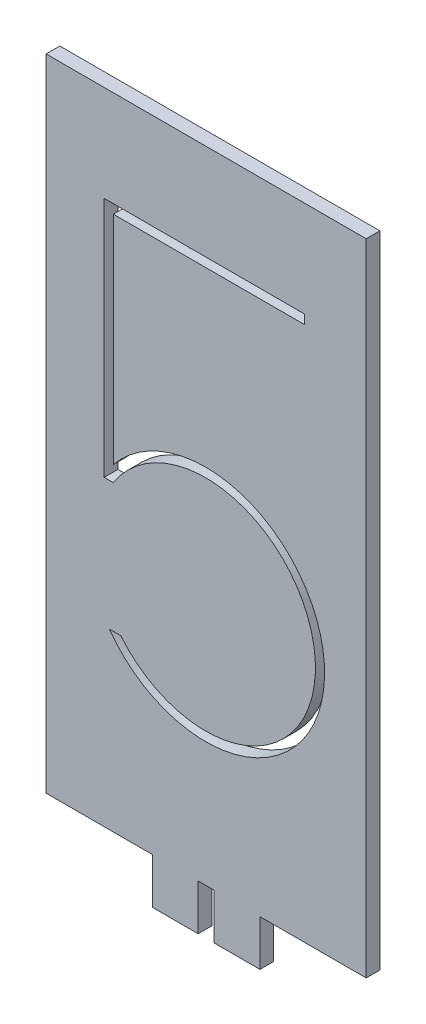
ISO-10303-21;
HEADER;
FILE_DESCRIPTION(('STEP AP214'),'2;1');
FILE_NAME('part.step','',(''),(''),'','','');
FILE_SCHEMA(('AUTOMOTIVE_DESIGN { 1 0 10303 214 1 1 1 1 }'));
ENDSEC;
DATA;
#1=APPLICATION_CONTEXT('core data for automotive mechanical design processes');
#2=APPLICATION_PROTOCOL_DEFINITION('international standard','automotive_design',2000,#1);
#3=PRODUCT_CONTEXT('',#1,'mechanical');
#4=PRODUCT('Part','Part','',(#3));
#5=PRODUCT_RELATED_PRODUCT_CATEGORY('part','',(#4));
#6=PRODUCT_DEFINITION_FORMATION('','',#4);
#7=PRODUCT_DEFINITION_CONTEXT('part definition',#1,'design');
#8=PRODUCT_DEFINITION('design','',#6,#7);
#9=PRODUCT_DEFINITION_SHAPE('','',#8);
#10=(LENGTH_UNIT() NAMED_UNIT(*) SI_UNIT(.MILLI.,.METRE.));
#11=(NAMED_UNIT(*) PLANE_ANGLE_UNIT() SI_UNIT($,.RADIAN.));
#12=(NAMED_UNIT(*) SI_UNIT($,.STERADIAN.) SOLID_ANGLE_UNIT());
#13=UNCERTAINTY_MEASURE_WITH_UNIT(LENGTH_MEASURE(1.E-05),#10,'distance_accuracy_value','');
#14=(GEOMETRIC_REPRESENTATION_CONTEXT(3) GLOBAL_UNCERTAINTY_ASSIGNED_CONTEXT((#13)) GLOBAL_UNIT_ASSIGNED_CONTEXT((#10,
#11,#12)) REPRESENTATION_CONTEXT('',''));
#15=CARTESIAN_POINT('',(0.,0.,0.));
#16=DIRECTION('',(0.,0.,1.));
#17=DIRECTION('',(1.,0.,0.));
#18=AXIS2_PLACEMENT_3D('',#15,#16,#17);
#19=CARTESIAN_POINT('',(0.,0.,1.5));
#20=DIRECTION('',(0.,1.,0.));
#21=DIRECTION('',(0.,0.,1.));
#22=AXIS2_PLACEMENT_3D('',#19,#20,#21);
#23=PLANE('',#22);
#24=DIRECTION('',(1.,0.,0.));
#25=VECTOR('',#24,1.);
#26=CARTESIAN_POINT('',(0.,0.,1.5));
#27=LINE('',#26,#25);
#28=CARTESIAN_POINT('',(11.63,0.,1.5));
#29=VERTEX_POINT('',#28);
#30=CARTESIAN_POINT('',(16.63,0.,1.5));
#31=VERTEX_POINT('',#30);
#32=EDGE_CURVE('E362',#29,#31,#27,.T.);
#33=ORIENTED_EDGE('',*,*,#32,.F.);
#34=DIRECTION('',(0.,0.,1.));
#35=VECTOR('',#34,1.);
#36=CARTESIAN_POINT('',(11.63,0.,0.));
#37=LINE('',#36,#35);
#38=CARTESIAN_POINT('',(11.63,0.,0.));
#39=VERTEX_POINT('',#38);
#40=EDGE_CURVE('E278',#39,#29,#37,.T.);
#41=ORIENTED_EDGE('',*,*,#40,.F.);
#42=DIRECTION('',(1.,0.,0.));
#43=VECTOR('',#42,1.);
#44=CARTESIAN_POINT('',(0.,0.,0.));
#45=LINE('',#44,#43);
#46=CARTESIAN_POINT('',(16.63,0.,0.));
#47=VERTEX_POINT('',#46);
#48=EDGE_CURVE('E377',#39,#47,#45,.T.);
#49=ORIENTED_EDGE('',*,*,#48,.T.);
#50=DIRECTION('',(0.,0.,1.));
#51=VECTOR('',#50,1.);
#52=CARTESIAN_POINT('',(16.63,0.,0.));
#53=LINE('',#52,#51);
#54=EDGE_CURVE('E332',#47,#31,#53,.T.);
#55=ORIENTED_EDGE('',*,*,#54,.T.);
#56=EDGE_LOOP('',(#33,#41,#49,#55));
#57=FACE_BOUND('',#56,.T.);
#58=ADVANCED_FACE('F39',(#57),#23,.F.);
#59=CARTESIAN_POINT('',(0.,0.,1.5));
#60=DIRECTION('',(1.,0.,0.));
#61=DIRECTION('',(0.,1.,0.));
#62=AXIS2_PLACEMENT_3D('',#59,#60,#61);
#63=PLANE('',#62);
#64=DIRECTION('',(0.,-1.,0.));
#65=VECTOR('',#64,1.);
#66=CARTESIAN_POINT('',(0.,0.,0.));
#67=LINE('',#66,#65);
#68=CARTESIAN_POINT('',(0.,75.,0.));
#69=VERTEX_POINT('',#68);
#70=CARTESIAN_POINT('',(0.,5.,0.));
#71=VERTEX_POINT('',#70);
#72=EDGE_CURVE('E290',#69,#71,#67,.T.);
#73=ORIENTED_EDGE('',*,*,#72,.T.);
#74=DIRECTION('',(0.,0.,1.));
#75=VECTOR('',#74,1.);
#76=CARTESIAN_POINT('',(0.,5.,0.));
#77=LINE('',#76,#75);
#78=CARTESIAN_POINT('',(0.,5.,1.5));
#79=VERTEX_POINT('',#78);
#80=EDGE_CURVE('E286',#71,#79,#77,.T.);
#81=ORIENTED_EDGE('',*,*,#80,.T.);
#82=DIRECTION('',(0.,-1.,0.));
#83=VECTOR('',#82,1.);
#84=CARTESIAN_POINT('',(0.,0.,1.5));
#85=LINE('',#84,#83);
#86=CARTESIAN_POINT('',(0.,75.,1.5));
#87=VERTEX_POINT('',#86);
#88=EDGE_CURVE('E353',#87,#79,#85,.T.);
#89=ORIENTED_EDGE('',*,*,#88,.F.);
#90=DIRECTION('',(0.,0.,-1.));
#91=VECTOR('',#90,1.);
#92=CARTESIAN_POINT('',(0.,75.,1.5));
#93=LINE('',#92,#91);
#94=EDGE_CURVE('E369',#87,#69,#93,.T.);
#95=ORIENTED_EDGE('',*,*,#94,.T.);
#96=EDGE_LOOP('',(#73,#81,#89,#95));
#97=FACE_BOUND('',#96,.T.);
#98=ADVANCED_FACE('F41',(#97),#63,.F.);
#99=CARTESIAN_POINT('',(18.38,0.,0.));
#100=VERTEX_POINT('',#99);
#101=CARTESIAN_POINT('',(23.38,0.,0.));
#102=VERTEX_POINT('',#101);
#103=EDGE_CURVE('E373',#100,#102,#45,.T.);
#104=ORIENTED_EDGE('',*,*,#103,.T.);
#105=DIRECTION('',(0.,0.,1.));
#106=VECTOR('',#105,1.);
#107=CARTESIAN_POINT('',(23.38,0.,0.));
#108=LINE('',#107,#106);
#109=CARTESIAN_POINT('',(23.38,0.,1.5));
#110=VERTEX_POINT('',#109);
#111=EDGE_CURVE('E303',#102,#110,#108,.T.);
#112=ORIENTED_EDGE('',*,*,#111,.T.);
#113=CARTESIAN_POINT('',(18.38,0.,1.5));
#114=VERTEX_POINT('',#113);
#115=EDGE_CURVE('E357',#114,#110,#27,.T.);
#116=ORIENTED_EDGE('',*,*,#115,.F.);
#117=DIRECTION('',(0.,0.,1.));
#118=VECTOR('',#117,1.);
#119=CARTESIAN_POINT('',(18.38,0.,0.));
#120=LINE('',#119,#118);
#121=EDGE_CURVE('E347',#100,#114,#120,.T.);
#122=ORIENTED_EDGE('',*,*,#121,.F.);
#123=EDGE_LOOP('',(#104,#112,#116,#122));
#124=FACE_BOUND('',#123,.T.);
#125=ADVANCED_FACE('F446',(#124),#23,.F.);
#126=CARTESIAN_POINT('',(35.,0.,1.5));
#127=DIRECTION('',(-1.,0.,0.));
#128=DIRECTION('',(0.,-1.,0.));
#129=AXIS2_PLACEMENT_3D('',#126,#127,#128);
#130=PLANE('',#129);
#131=DIRECTION('',(0.,1.,0.));
#132=VECTOR('',#131,1.);
#133=CARTESIAN_POINT('',(35.,0.,1.5));
#134=LINE('',#133,#132);
#135=CARTESIAN_POINT('',(35.,5.,1.5));
#136=VERTEX_POINT('',#135);
#137=CARTESIAN_POINT('',(35.,75.,1.5));
#138=VERTEX_POINT('',#137);
#139=EDGE_CURVE('E363',#136,#138,#134,.T.);
#140=ORIENTED_EDGE('',*,*,#139,.F.);
#141=DIRECTION('',(0.,0.,1.));
#142=VECTOR('',#141,1.);
#143=CARTESIAN_POINT('',(35.,5.,0.));
#144=LINE('',#143,#142);
#145=CARTESIAN_POINT('',(35.,5.,0.));
#146=VERTEX_POINT('',#145);
#147=EDGE_CURVE('E313',#146,#136,#144,.T.);
#148=ORIENTED_EDGE('',*,*,#147,.F.);
#149=DIRECTION('',(0.,1.,0.));
#150=VECTOR('',#149,1.);
#151=CARTESIAN_POINT('',(35.,0.,0.));
#152=LINE('',#151,#150);
#153=CARTESIAN_POINT('',(35.,75.,0.));
#154=VERTEX_POINT('',#153);
#155=EDGE_CURVE('E378',#146,#154,#152,.T.);
#156=ORIENTED_EDGE('',*,*,#155,.T.);
#157=DIRECTION('',(0.,0.,-1.));
#158=VECTOR('',#157,1.);
#159=CARTESIAN_POINT('',(35.,75.,1.5));
#160=LINE('',#159,#158);
#161=EDGE_CURVE('E386',#138,#154,#160,.T.);
#162=ORIENTED_EDGE('',*,*,#161,.F.);
#163=EDGE_LOOP('',(#140,#148,#156,#162));
#164=FACE_BOUND('',#163,.T.);
#165=ADVANCED_FACE('F454',(#164),#130,.F.);
#166=CARTESIAN_POINT('',(0.,75.,1.5));
#167=DIRECTION('',(0.,-1.,0.));
#168=DIRECTION('',(0.,0.,-1.));
#169=AXIS2_PLACEMENT_3D('',#166,#167,#168);
#170=PLANE('',#169);
#171=DIRECTION('',(-1.,0.,0.));
#172=VECTOR('',#171,1.);
#173=CARTESIAN_POINT('',(0.,75.,0.));
#174=LINE('',#173,#172);
#175=EDGE_CURVE('E358',#154,#69,#174,.T.);
#176=ORIENTED_EDGE('',*,*,#175,.T.);
#177=ORIENTED_EDGE('',*,*,#94,.F.);
#178=DIRECTION('',(-1.,0.,0.));
#179=VECTOR('',#178,1.);
#180=CARTESIAN_POINT('',(0.,75.,1.5));
#181=LINE('',#180,#179);
#182=EDGE_CURVE('E366',#138,#87,#181,.T.);
#183=ORIENTED_EDGE('',*,*,#182,.F.);
#184=ORIENTED_EDGE('',*,*,#161,.T.);
#185=EDGE_LOOP('',(#176,#177,#183,#184));
#186=FACE_BOUND('',#185,.T.);
#187=ADVANCED_FACE('F459',(#186),#170,.F.);
#188=CARTESIAN_POINT('',(0.,0.,1.5));
#189=DIRECTION('',(0.,0.,-1.));
#190=DIRECTION('',(-1.,0.,0.));
#191=AXIS2_PLACEMENT_3D('',#188,#189,#190);
#192=PLANE('',#191);
#193=DIRECTION('',(1.,0.,0.));
#194=VECTOR('',#193,1.);
#195=CARTESIAN_POINT('',(7.35039959030423,63.5,1.5));
#196=LINE('',#195,#194);
#197=CARTESIAN_POINT('',(7.35039959030423,63.5,1.5));
#198=VERTEX_POINT('',#197);
#199=CARTESIAN_POINT('',(28.25,63.5,1.5));
#200=VERTEX_POINT('',#199);
#201=EDGE_CURVE('E187',#198,#200,#196,.T.);
#202=ORIENTED_EDGE('',*,*,#201,.F.);
#203=DIRECTION('',(0.,1.,0.));
#204=VECTOR('',#203,1.);
#205=CARTESIAN_POINT('',(7.35039959030423,38.0829980740736,1.5));
#206=LINE('',#205,#204);
#207=CARTESIAN_POINT('',(7.35039959030423,39.787205515762,1.5));
#208=VERTEX_POINT('',#207);
#209=EDGE_CURVE('E198',#208,#198,#206,.T.);
#210=ORIENTED_EDGE('',*,*,#209,.F.);
#211=CARTESIAN_POINT('',(17.4486572006261,31.6003139667322,1.5));
#212=DIRECTION('',(0.,0.,1.));
#213=DIRECTION('',(1.,0.,0.));
#214=AXIS2_PLACEMENT_3D('',#211,#212,#213);
#215=CIRCLE('',#214,13.);
#216=CARTESIAN_POINT('',(6.90262565731403,23.9989181286333,1.5));
#217=VERTEX_POINT('',#216);
#218=EDGE_CURVE('E249',#217,#208,#215,.T.);
#219=ORIENTED_EDGE('',*,*,#218,.F.);
#220=DIRECTION('',(-1.,0.,0.));
#221=VECTOR('',#220,1.);
#222=CARTESIAN_POINT('',(8.16325029987408,23.9989181286333,1.5));
#223=LINE('',#222,#221);
#224=CARTESIAN_POINT('',(8.16325029987408,23.9989181286333,1.5));
#225=VERTEX_POINT('',#224);
#226=EDGE_CURVE('E256',#225,#217,#223,.T.);
#227=ORIENTED_EDGE('',*,*,#226,.F.);
#228=CARTESIAN_POINT('',(17.4486572006261,31.6003139667322,1.5));
#229=DIRECTION('',(0.,0.,-1.));
#230=DIRECTION('',(1.,0.,0.));
#231=AXIS2_PLACEMENT_3D('',#228,#229,#230);
#232=CIRCLE('',#231,12.);
#233=CARTESIAN_POINT('',(7.35039959030423,38.0829980740736,1.5));
#234=VERTEX_POINT('',#233);
#235=EDGE_CURVE('E252',#234,#225,#232,.T.);
#236=ORIENTED_EDGE('',*,*,#235,.F.);
#237=DIRECTION('',(1.,0.,0.));
#238=VECTOR('',#237,1.);
#239=CARTESIAN_POINT('',(7.35039959030423,38.0829980740736,1.5));
#240=LINE('',#239,#238);
#241=CARTESIAN_POINT('',(6.35039959030423,38.0829980740736,1.5));
#242=VERTEX_POINT('',#241);
#243=EDGE_CURVE('E195',#242,#234,#240,.T.);
#244=ORIENTED_EDGE('',*,*,#243,.F.);
#245=DIRECTION('',(0.,-1.,0.));
#246=VECTOR('',#245,1.);
#247=CARTESIAN_POINT('',(6.35039959030423,38.0829980740736,1.5));
#248=LINE('',#247,#246);
#249=CARTESIAN_POINT('',(6.35039959030423,64.5,1.5));
#250=VERTEX_POINT('',#249);
#251=EDGE_CURVE('E221',#250,#242,#248,.T.);
#252=ORIENTED_EDGE('',*,*,#251,.F.);
#253=DIRECTION('',(-1.,0.,0.));
#254=VECTOR('',#253,1.);
#255=CARTESIAN_POINT('',(7.35039959030423,64.5,1.5));
#256=LINE('',#255,#254);
#257=CARTESIAN_POINT('',(28.25,64.5,1.5));
#258=VERTEX_POINT('',#257);
#259=EDGE_CURVE('E215',#258,#250,#256,.T.);
#260=ORIENTED_EDGE('',*,*,#259,.F.);
#261=DIRECTION('',(0.,1.,0.));
#262=VECTOR('',#261,1.);
#263=CARTESIAN_POINT('',(28.25,64.5,1.5));
#264=LINE('',#263,#262);
#265=EDGE_CURVE('E211',#200,#258,#264,.T.);
#266=ORIENTED_EDGE('',*,*,#265,.F.);
#267=EDGE_LOOP('',(#202,#210,#219,#227,#236,#244,#252,#260,#266));
#268=FACE_BOUND('',#267,.T.);
#269=ORIENTED_EDGE('',*,*,#88,.T.);
#270=DIRECTION('',(-1.,0.,0.));
#271=VECTOR('',#270,1.);
#272=CARTESIAN_POINT('',(0.,5.,1.5));
#273=LINE('',#272,#271);
#274=CARTESIAN_POINT('',(11.63,5.,1.5));
#275=VERTEX_POINT('',#274);
#276=EDGE_CURVE('E275',#275,#79,#273,.T.);
#277=ORIENTED_EDGE('',*,*,#276,.F.);
#278=DIRECTION('',(0.,1.,0.));
#279=VECTOR('',#278,1.);
#280=CARTESIAN_POINT('',(11.63,0.,1.5));
#281=LINE('',#280,#279);
#282=EDGE_CURVE('E279',#29,#275,#281,.T.);
#283=ORIENTED_EDGE('',*,*,#282,.F.);
#284=ORIENTED_EDGE('',*,*,#32,.T.);
#285=DIRECTION('',(0.,-1.,0.));
#286=VECTOR('',#285,1.);
#287=CARTESIAN_POINT('',(16.63,0.,1.5));
#288=LINE('',#287,#286);
#289=CARTESIAN_POINT('',(16.63,5.,1.5));
#290=VERTEX_POINT('',#289);
#291=EDGE_CURVE('E264',#290,#31,#288,.T.);
#292=ORIENTED_EDGE('',*,*,#291,.F.);
#293=DIRECTION('',(-1.,0.,0.));
#294=VECTOR('',#293,1.);
#295=CARTESIAN_POINT('',(16.63,5.,1.5));
#296=LINE('',#295,#294);
#297=CARTESIAN_POINT('',(18.38,5.,1.5));
#298=VERTEX_POINT('',#297);
#299=EDGE_CURVE('E324',#298,#290,#296,.T.);
#300=ORIENTED_EDGE('',*,*,#299,.F.);
#301=DIRECTION('',(0.,1.,0.));
#302=VECTOR('',#301,1.);
#303=CARTESIAN_POINT('',(18.38,0.,1.5));
#304=LINE('',#303,#302);
#305=EDGE_CURVE('E335',#114,#298,#304,.T.);
#306=ORIENTED_EDGE('',*,*,#305,.F.);
#307=ORIENTED_EDGE('',*,*,#115,.T.);
#308=DIRECTION('',(0.,-1.,0.));
#309=VECTOR('',#308,1.);
#310=CARTESIAN_POINT('',(23.38,5.,1.5));
#311=LINE('',#310,#309);
#312=CARTESIAN_POINT('',(23.38,5.,1.5));
#313=VERTEX_POINT('',#312);
#314=EDGE_CURVE('E304',#313,#110,#311,.T.);
#315=ORIENTED_EDGE('',*,*,#314,.F.);
#316=DIRECTION('',(-1.,0.,0.));
#317=VECTOR('',#316,1.);
#318=CARTESIAN_POINT('',(23.38,5.,1.5));
#319=LINE('',#318,#317);
#320=EDGE_CURVE('E299',#136,#313,#319,.T.);
#321=ORIENTED_EDGE('',*,*,#320,.F.);
#322=ORIENTED_EDGE('',*,*,#139,.T.);
#323=ORIENTED_EDGE('',*,*,#182,.T.);
#324=EDGE_LOOP('',(#269,#277,#283,#284,#292,#300,#306,#307,#315,#321,#322,#323));
#325=FACE_BOUND('',#324,.T.);
#326=ADVANCED_FACE('F207',(#268,#325),#192,.F.);
#327=CARTESIAN_POINT('',(0.,0.,0.));
#328=DIRECTION('',(0.,0.,-1.));
#329=DIRECTION('',(-1.,0.,0.));
#330=AXIS2_PLACEMENT_3D('',#327,#328,#329);
#331=PLANE('',#330);
#332=DIRECTION('',(0.,-1.,0.));
#333=VECTOR('',#332,1.);
#334=CARTESIAN_POINT('',(7.35039959030423,0.,0.));
#335=LINE('',#334,#333);
#336=CARTESIAN_POINT('',(7.35039959030423,63.5,0.));
#337=VERTEX_POINT('',#336);
#338=CARTESIAN_POINT('',(7.35039959030423,39.787205515762,0.));
#339=VERTEX_POINT('',#338);
#340=EDGE_CURVE('E246',#337,#339,#335,.T.);
#341=ORIENTED_EDGE('',*,*,#340,.F.);
#342=DIRECTION('',(-1.,0.,0.));
#343=VECTOR('',#342,1.);
#344=CARTESIAN_POINT('',(0.,63.5,0.));
#345=LINE('',#344,#343);
#346=CARTESIAN_POINT('',(28.25,63.5,0.));
#347=VERTEX_POINT('',#346);
#348=EDGE_CURVE('E190',#347,#337,#345,.T.);
#349=ORIENTED_EDGE('',*,*,#348,.F.);
#350=DIRECTION('',(0.,-1.,0.));
#351=VECTOR('',#350,1.);
#352=CARTESIAN_POINT('',(28.25,0.,0.));
#353=LINE('',#352,#351);
#354=CARTESIAN_POINT('',(28.25,64.5,0.));
#355=VERTEX_POINT('',#354);
#356=EDGE_CURVE('E48',#355,#347,#353,.T.);
#357=ORIENTED_EDGE('',*,*,#356,.F.);
#358=DIRECTION('',(1.,0.,0.));
#359=VECTOR('',#358,1.);
#360=CARTESIAN_POINT('',(0.,64.5,0.));
#361=LINE('',#360,#359);
#362=CARTESIAN_POINT('',(6.35039959030423,64.5,0.));
#363=VERTEX_POINT('',#362);
#364=EDGE_CURVE('E11',#363,#355,#361,.T.);
#365=ORIENTED_EDGE('',*,*,#364,.F.);
#366=DIRECTION('',(0.,1.,0.));
#367=VECTOR('',#366,1.);
#368=CARTESIAN_POINT('',(6.35039959030423,0.,0.));
#369=LINE('',#368,#367);
#370=CARTESIAN_POINT('',(6.35039959030423,38.0829980740736,0.));
#371=VERTEX_POINT('',#370);
#372=EDGE_CURVE('E230',#371,#363,#369,.T.);
#373=ORIENTED_EDGE('',*,*,#372,.F.);
#374=DIRECTION('',(-1.,0.,0.));
#375=VECTOR('',#374,1.);
#376=CARTESIAN_POINT('',(0.,38.0829980740736,0.));
#377=LINE('',#376,#375);
#378=CARTESIAN_POINT('',(7.35039959030423,38.0829980740736,0.));
#379=VERTEX_POINT('',#378);
#380=EDGE_CURVE('E241',#379,#371,#377,.T.);
#381=ORIENTED_EDGE('',*,*,#380,.F.);
#382=CARTESIAN_POINT('',(17.4486572006261,31.6003139667322,0.));
#383=DIRECTION('',(0.,0.,-1.));
#384=DIRECTION('',(-1.,0.,0.));
#385=AXIS2_PLACEMENT_3D('',#382,#383,#384);
#386=CIRCLE('',#385,12.);
#387=CARTESIAN_POINT('',(8.16325029987408,23.9989181286333,0.));
#388=VERTEX_POINT('',#387);
#389=EDGE_CURVE('E390',#388,#379,#386,.F.);
#390=ORIENTED_EDGE('',*,*,#389,.F.);
#391=DIRECTION('',(1.,0.,0.));
#392=VECTOR('',#391,1.);
#393=CARTESIAN_POINT('',(0.,23.9989181286333,0.));
#394=LINE('',#393,#392);
#395=CARTESIAN_POINT('',(6.90262565731403,23.9989181286333,0.));
#396=VERTEX_POINT('',#395);
#397=EDGE_CURVE('E394',#396,#388,#394,.T.);
#398=ORIENTED_EDGE('',*,*,#397,.F.);
#399=CARTESIAN_POINT('',(17.4486572006261,31.6003139667322,0.));
#400=DIRECTION('',(0.,0.,-1.));
#401=DIRECTION('',(-1.,0.,0.));
#402=AXIS2_PLACEMENT_3D('',#399,#400,#401);
#403=CIRCLE('',#402,13.);
#404=EDGE_CURVE('E397',#339,#396,#403,.T.);
#405=ORIENTED_EDGE('',*,*,#404,.F.);
#406=EDGE_LOOP('',(#341,#349,#357,#365,#373,#381,#390,#398,#405));
#407=FACE_BOUND('',#406,.T.);
#408=DIRECTION('',(-1.,0.,0.));
#409=VECTOR('',#408,1.);
#410=CARTESIAN_POINT('',(0.,5.,0.));
#411=LINE('',#410,#409);
#412=CARTESIAN_POINT('',(11.63,5.,0.));
#413=VERTEX_POINT('',#412);
#414=EDGE_CURVE('E55',#413,#71,#411,.T.);
#415=ORIENTED_EDGE('',*,*,#414,.T.);
#416=ORIENTED_EDGE('',*,*,#72,.F.);
#417=ORIENTED_EDGE('',*,*,#175,.F.);
#418=ORIENTED_EDGE('',*,*,#155,.F.);
#419=DIRECTION('',(-1.,0.,0.));
#420=VECTOR('',#419,1.);
#421=CARTESIAN_POINT('',(23.38,5.,0.));
#422=LINE('',#421,#420);
#423=CARTESIAN_POINT('',(23.38,5.,0.));
#424=VERTEX_POINT('',#423);
#425=EDGE_CURVE('E298',#146,#424,#422,.T.);
#426=ORIENTED_EDGE('',*,*,#425,.T.);
#427=DIRECTION('',(0.,-1.,0.));
#428=VECTOR('',#427,1.);
#429=CARTESIAN_POINT('',(23.38,5.,0.));
#430=LINE('',#429,#428);
#431=EDGE_CURVE('E63',#424,#102,#430,.T.);
#432=ORIENTED_EDGE('',*,*,#431,.T.);
#433=ORIENTED_EDGE('',*,*,#103,.F.);
#434=DIRECTION('',(0.,1.,0.));
#435=VECTOR('',#434,1.);
#436=CARTESIAN_POINT('',(18.38,0.,0.));
#437=LINE('',#436,#435);
#438=CARTESIAN_POINT('',(18.38,5.,0.));
#439=VERTEX_POINT('',#438);
#440=EDGE_CURVE('E323',#100,#439,#437,.T.);
#441=ORIENTED_EDGE('',*,*,#440,.T.);
#442=DIRECTION('',(-1.,0.,0.));
#443=VECTOR('',#442,1.);
#444=CARTESIAN_POINT('',(16.63,5.,0.));
#445=LINE('',#444,#443);
#446=CARTESIAN_POINT('',(16.63,5.,0.));
#447=VERTEX_POINT('',#446);
#448=EDGE_CURVE('E328',#439,#447,#445,.T.);
#449=ORIENTED_EDGE('',*,*,#448,.T.);
#450=DIRECTION('',(0.,-1.,0.));
#451=VECTOR('',#450,1.);
#452=CARTESIAN_POINT('',(16.63,0.,0.));
#453=LINE('',#452,#451);
#454=EDGE_CURVE('E319',#447,#47,#453,.T.);
#455=ORIENTED_EDGE('',*,*,#454,.T.);
#456=ORIENTED_EDGE('',*,*,#48,.F.);
#457=DIRECTION('',(0.,1.,0.));
#458=VECTOR('',#457,1.);
#459=CARTESIAN_POINT('',(11.63,0.,0.));
#460=LINE('',#459,#458);
#461=EDGE_CURVE('E271',#39,#413,#460,.T.);
#462=ORIENTED_EDGE('',*,*,#461,.T.);
#463=EDGE_LOOP('',(#415,#416,#417,#418,#426,#432,#433,#441,#449,#455,#456,#462));
#464=FACE_BOUND('',#463,.T.);
#465=ADVANCED_FACE('F408',(#407,#464),#331,.T.);
#466=CARTESIAN_POINT('',(16.63,0.,0.));
#467=DIRECTION('',(-1.,0.,0.));
#468=DIRECTION('',(0.,0.,1.));
#469=AXIS2_PLACEMENT_3D('',#466,#467,#468);
#470=PLANE('',#469);
#471=ORIENTED_EDGE('',*,*,#291,.T.);
#472=ORIENTED_EDGE('',*,*,#54,.F.);
#473=ORIENTED_EDGE('',*,*,#454,.F.);
#474=DIRECTION('',(0.,0.,1.));
#475=VECTOR('',#474,1.);
#476=CARTESIAN_POINT('',(16.63,5.,0.));
#477=LINE('',#476,#475);
#478=EDGE_CURVE('E307',#447,#290,#477,.T.);
#479=ORIENTED_EDGE('',*,*,#478,.T.);
#480=EDGE_LOOP('',(#471,#472,#473,#479));
#481=FACE_BOUND('',#480,.T.);
#482=ADVANCED_FACE('F492',(#481),#470,.F.);
#483=CARTESIAN_POINT('',(16.63,5.,0.));
#484=DIRECTION('',(0.,1.,0.));
#485=DIRECTION('',(0.,0.,1.));
#486=AXIS2_PLACEMENT_3D('',#483,#484,#485);
#487=PLANE('',#486);
#488=ORIENTED_EDGE('',*,*,#299,.T.);
#489=ORIENTED_EDGE('',*,*,#478,.F.);
#490=ORIENTED_EDGE('',*,*,#448,.F.);
#491=DIRECTION('',(0.,0.,1.));
#492=VECTOR('',#491,1.);
#493=CARTESIAN_POINT('',(18.38,5.,0.));
#494=LINE('',#493,#492);
#495=EDGE_CURVE('E344',#439,#298,#494,.T.);
#496=ORIENTED_EDGE('',*,*,#495,.T.);
#497=EDGE_LOOP('',(#488,#489,#490,#496));
#498=FACE_BOUND('',#497,.T.);
#499=ADVANCED_FACE('F486',(#498),#487,.F.);
#500=CARTESIAN_POINT('',(18.38,0.,0.));
#501=DIRECTION('',(1.,0.,0.));
#502=DIRECTION('',(0.,0.,-1.));
#503=AXIS2_PLACEMENT_3D('',#500,#501,#502);
#504=PLANE('',#503);
#505=ORIENTED_EDGE('',*,*,#305,.T.);
#506=ORIENTED_EDGE('',*,*,#495,.F.);
#507=ORIENTED_EDGE('',*,*,#440,.F.);
#508=ORIENTED_EDGE('',*,*,#121,.T.);
#509=EDGE_LOOP('',(#505,#506,#507,#508));
#510=FACE_BOUND('',#509,.T.);
#511=ADVANCED_FACE('F478',(#510),#504,.F.);
#512=CARTESIAN_POINT('',(23.38,5.,0.));
#513=DIRECTION('',(-1.,0.,0.));
#514=DIRECTION('',(0.,0.,1.));
#515=AXIS2_PLACEMENT_3D('',#512,#513,#514);
#516=PLANE('',#515);
#517=ORIENTED_EDGE('',*,*,#314,.T.);
#518=ORIENTED_EDGE('',*,*,#111,.F.);
#519=ORIENTED_EDGE('',*,*,#431,.F.);
#520=DIRECTION('',(0.,0.,1.));
#521=VECTOR('',#520,1.);
#522=CARTESIAN_POINT('',(23.38,5.,0.));
#523=LINE('',#522,#521);
#524=EDGE_CURVE('E283',#424,#313,#523,.T.);
#525=ORIENTED_EDGE('',*,*,#524,.T.);
#526=EDGE_LOOP('',(#517,#518,#519,#525));
#527=FACE_BOUND('',#526,.T.);
#528=ADVANCED_FACE('F476',(#527),#516,.F.);
#529=CARTESIAN_POINT('',(23.38,5.,0.));
#530=DIRECTION('',(0.,1.,0.));
#531=DIRECTION('',(0.,0.,1.));
#532=AXIS2_PLACEMENT_3D('',#529,#530,#531);
#533=PLANE('',#532);
#534=ORIENTED_EDGE('',*,*,#320,.T.);
#535=ORIENTED_EDGE('',*,*,#524,.F.);
#536=ORIENTED_EDGE('',*,*,#425,.F.);
#537=ORIENTED_EDGE('',*,*,#147,.T.);
#538=EDGE_LOOP('',(#534,#535,#536,#537));
#539=FACE_BOUND('',#538,.T.);
#540=ADVANCED_FACE('F468',(#539),#533,.F.);
#541=CARTESIAN_POINT('',(0.,5.,0.));
#542=DIRECTION('',(0.,1.,0.));
#543=DIRECTION('',(0.,0.,1.));
#544=AXIS2_PLACEMENT_3D('',#541,#542,#543);
#545=PLANE('',#544);
#546=ORIENTED_EDGE('',*,*,#276,.T.);
#547=ORIENTED_EDGE('',*,*,#80,.F.);
#548=ORIENTED_EDGE('',*,*,#414,.F.);
#549=DIRECTION('',(0.,0.,1.));
#550=VECTOR('',#549,1.);
#551=CARTESIAN_POINT('',(11.63,5.,0.));
#552=LINE('',#551,#550);
#553=EDGE_CURVE('E291',#413,#275,#552,.T.);
#554=ORIENTED_EDGE('',*,*,#553,.T.);
#555=EDGE_LOOP('',(#546,#547,#548,#554));
#556=FACE_BOUND('',#555,.T.);
#557=ADVANCED_FACE('F484',(#556),#545,.F.);
#558=CARTESIAN_POINT('',(11.63,0.,0.));
#559=DIRECTION('',(1.,0.,0.));
#560=DIRECTION('',(0.,1.,0.));
#561=AXIS2_PLACEMENT_3D('',#558,#559,#560);
#562=PLANE('',#561);
#563=ORIENTED_EDGE('',*,*,#282,.T.);
#564=ORIENTED_EDGE('',*,*,#553,.F.);
#565=ORIENTED_EDGE('',*,*,#461,.F.);
#566=ORIENTED_EDGE('',*,*,#40,.T.);
#567=EDGE_LOOP('',(#563,#564,#565,#566));
#568=FACE_BOUND('',#567,.T.);
#569=ADVANCED_FACE('F512',(#568),#562,.F.);
#570=CARTESIAN_POINT('',(17.4486572006261,31.6003139667322,-18.5));
#571=DIRECTION('',(0.,0.,1.));
#572=DIRECTION('',(1.,0.,0.));
#573=AXIS2_PLACEMENT_3D('',#570,#571,#572);
#574=CYLINDRICAL_SURFACE('',#573,13.);
#575=ORIENTED_EDGE('',*,*,#218,.T.);
#576=DIRECTION('',(0.,0.,1.));
#577=VECTOR('',#576,1.);
#578=CARTESIAN_POINT('',(7.35039959030423,39.787205515762,-18.5));
#579=LINE('',#578,#577);
#580=EDGE_CURVE('E201',#208,#339,#579,.F.);
#581=ORIENTED_EDGE('',*,*,#580,.T.);
#582=ORIENTED_EDGE('',*,*,#404,.T.);
#583=DIRECTION('',(0.,0.,1.));
#584=VECTOR('',#583,1.);
#585=CARTESIAN_POINT('',(6.90262565731403,23.9989181286333,-18.5));
#586=LINE('',#585,#584);
#587=EDGE_CURVE('E261',#396,#217,#586,.T.);
#588=ORIENTED_EDGE('',*,*,#587,.T.);
#589=EDGE_LOOP('',(#575,#581,#582,#588));
#590=FACE_BOUND('',#589,.T.);
#591=ADVANCED_FACE('F413',(#590),#574,.F.);
#592=CARTESIAN_POINT('',(8.16325029987408,23.9989181286333,-18.5));
#593=DIRECTION('',(0.,1.,0.));
#594=DIRECTION('',(0.,0.,1.));
#595=AXIS2_PLACEMENT_3D('',#592,#593,#594);
#596=PLANE('',#595);
#597=ORIENTED_EDGE('',*,*,#397,.T.);
#598=DIRECTION('',(0.,0.,1.));
#599=VECTOR('',#598,1.);
#600=CARTESIAN_POINT('',(8.16325029987408,23.9989181286333,-18.5));
#601=LINE('',#600,#599);
#602=EDGE_CURVE('E265',#388,#225,#601,.T.);
#603=ORIENTED_EDGE('',*,*,#602,.T.);
#604=ORIENTED_EDGE('',*,*,#226,.T.);
#605=ORIENTED_EDGE('',*,*,#587,.F.);
#606=EDGE_LOOP('',(#597,#603,#604,#605));
#607=FACE_BOUND('',#606,.T.);
#608=ADVANCED_FACE('F419',(#607),#596,.F.);
#609=CARTESIAN_POINT('',(17.4486572006261,31.6003139667322,-18.5));
#610=DIRECTION('',(0.,0.,1.));
#611=DIRECTION('',(1.,0.,0.));
#612=AXIS2_PLACEMENT_3D('',#609,#610,#611);
#613=CYLINDRICAL_SURFACE('',#612,12.);
#614=ORIENTED_EDGE('',*,*,#389,.T.);
#615=DIRECTION('',(0.,0.,1.));
#616=VECTOR('',#615,1.);
#617=CARTESIAN_POINT('',(7.35039959030423,38.0829980740736,-18.5));
#618=LINE('',#617,#616);
#619=EDGE_CURVE('E260',#379,#234,#618,.T.);
#620=ORIENTED_EDGE('',*,*,#619,.T.);
#621=ORIENTED_EDGE('',*,*,#235,.T.);
#622=ORIENTED_EDGE('',*,*,#602,.F.);
#623=EDGE_LOOP('',(#614,#620,#621,#622));
#624=FACE_BOUND('',#623,.T.);
#625=ADVANCED_FACE('F423',(#624),#613,.T.);
#626=CARTESIAN_POINT('',(6.35039959030423,38.0829980740736,-18.5));
#627=DIRECTION('',(-1.,0.,0.));
#628=DIRECTION('',(0.,0.,1.));
#629=AXIS2_PLACEMENT_3D('',#626,#627,#628);
#630=PLANE('',#629);
#631=ORIENTED_EDGE('',*,*,#372,.T.);
#632=DIRECTION('',(0.,0.,1.));
#633=VECTOR('',#632,1.);
#634=CARTESIAN_POINT('',(6.35039959030423,64.5,-18.5));
#635=LINE('',#634,#633);
#636=EDGE_CURVE('E231',#363,#250,#635,.T.);
#637=ORIENTED_EDGE('',*,*,#636,.T.);
#638=ORIENTED_EDGE('',*,*,#251,.T.);
#639=DIRECTION('',(0.,0.,1.));
#640=VECTOR('',#639,1.);
#641=CARTESIAN_POINT('',(6.35039959030423,38.0829980740736,-18.5));
#642=LINE('',#641,#640);
#643=EDGE_CURVE('E226',#371,#242,#642,.T.);
#644=ORIENTED_EDGE('',*,*,#643,.F.);
#645=EDGE_LOOP('',(#631,#637,#638,#644));
#646=FACE_BOUND('',#645,.T.);
#647=ADVANCED_FACE('F431',(#646),#630,.F.);
#648=CARTESIAN_POINT('',(7.35039959030423,38.0829980740736,-18.5));
#649=DIRECTION('',(1.,0.,0.));
#650=DIRECTION('',(0.,0.,-1.));
#651=AXIS2_PLACEMENT_3D('',#648,#649,#650);
#652=PLANE('',#651);
#653=ORIENTED_EDGE('',*,*,#340,.T.);
#654=ORIENTED_EDGE('',*,*,#580,.F.);
#655=ORIENTED_EDGE('',*,*,#209,.T.);
#656=DIRECTION('',(0.,0.,1.));
#657=VECTOR('',#656,1.);
#658=CARTESIAN_POINT('',(7.35039959030423,63.5,-18.5));
#659=LINE('',#658,#657);
#660=EDGE_CURVE('E182',#337,#198,#659,.T.);
#661=ORIENTED_EDGE('',*,*,#660,.F.);
#662=EDGE_LOOP('',(#653,#654,#655,#661));
#663=FACE_BOUND('',#662,.T.);
#664=ADVANCED_FACE('F199',(#663),#652,.F.);
#665=CARTESIAN_POINT('',(7.35039959030423,38.0829980740736,-18.5));
#666=DIRECTION('',(0.,-1.,0.));
#667=DIRECTION('',(0.,0.,-1.));
#668=AXIS2_PLACEMENT_3D('',#665,#666,#667);
#669=PLANE('',#668);
#670=ORIENTED_EDGE('',*,*,#380,.T.);
#671=ORIENTED_EDGE('',*,*,#643,.T.);
#672=ORIENTED_EDGE('',*,*,#243,.T.);
#673=ORIENTED_EDGE('',*,*,#619,.F.);
#674=EDGE_LOOP('',(#670,#671,#672,#673));
#675=FACE_BOUND('',#674,.T.);
#676=ADVANCED_FACE('F426',(#675),#669,.F.);
#677=CARTESIAN_POINT('',(7.35039959030423,64.5,-18.5));
#678=DIRECTION('',(0.,1.,0.));
#679=DIRECTION('',(0.,0.,1.));
#680=AXIS2_PLACEMENT_3D('',#677,#678,#679);
#681=PLANE('',#680);
#682=ORIENTED_EDGE('',*,*,#364,.T.);
#683=DIRECTION('',(0.,0.,1.));
#684=VECTOR('',#683,1.);
#685=CARTESIAN_POINT('',(28.25,64.5,-18.5));
#686=LINE('',#685,#684);
#687=EDGE_CURVE('E234',#355,#258,#686,.T.);
#688=ORIENTED_EDGE('',*,*,#687,.T.);
#689=ORIENTED_EDGE('',*,*,#259,.T.);
#690=ORIENTED_EDGE('',*,*,#636,.F.);
#691=EDGE_LOOP('',(#682,#688,#689,#690));
#692=FACE_BOUND('',#691,.T.);
#693=ADVANCED_FACE('F433',(#692),#681,.F.);
#694=CARTESIAN_POINT('',(28.25,64.5,-18.5));
#695=DIRECTION('',(1.,0.,0.));
#696=DIRECTION('',(0.,0.,-1.));
#697=AXIS2_PLACEMENT_3D('',#694,#695,#696);
#698=PLANE('',#697);
#699=ORIENTED_EDGE('',*,*,#356,.T.);
#700=DIRECTION('',(0.,0.,1.));
#701=VECTOR('',#700,1.);
#702=CARTESIAN_POINT('',(28.25,63.5,-18.5));
#703=LINE('',#702,#701);
#704=EDGE_CURVE('E194',#347,#200,#703,.T.);
#705=ORIENTED_EDGE('',*,*,#704,.T.);
#706=ORIENTED_EDGE('',*,*,#265,.T.);
#707=ORIENTED_EDGE('',*,*,#687,.F.);
#708=EDGE_LOOP('',(#699,#705,#706,#707));
#709=FACE_BOUND('',#708,.T.);
#710=ADVANCED_FACE('F405',(#709),#698,.F.);
#711=CARTESIAN_POINT('',(7.35039959030423,63.5,-18.5));
#712=DIRECTION('',(0.,-1.,0.));
#713=DIRECTION('',(0.,0.,-1.));
#714=AXIS2_PLACEMENT_3D('',#711,#712,#713);
#715=PLANE('',#714);
#716=ORIENTED_EDGE('',*,*,#348,.T.);
#717=ORIENTED_EDGE('',*,*,#660,.T.);
#718=ORIENTED_EDGE('',*,*,#201,.T.);
#719=ORIENTED_EDGE('',*,*,#704,.F.);
#720=EDGE_LOOP('',(#716,#717,#718,#719));
#721=FACE_BOUND('',#720,.T.);
#722=ADVANCED_FACE('F184',(#721),#715,.F.);
#723=CLOSED_SHELL('',(#58,#98,#125,#165,#187,#326,#465,#482,#499,#511,#528,#540,#557,#569,#591,
#608,#625,#647,#664,#676,#693,#710,#722));
#724=MANIFOLD_SOLID_BREP('B2',#723);
#725=ADVANCED_BREP_SHAPE_REPRESENTATION('',(#18,#724),#14);
#726=SHAPE_DEFINITION_REPRESENTATION(#9,#725);
ENDSEC;
END-ISO-10303-21;
